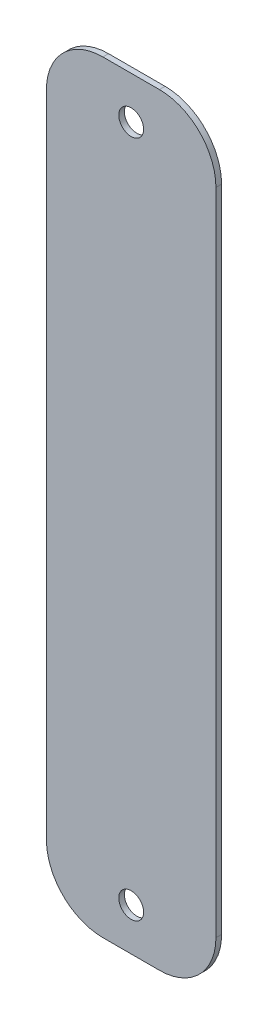
ISO-10303-21;
HEADER;
FILE_DESCRIPTION(('STEP AP214'),'2;1');
FILE_NAME('part.step','',(''),(''),'','','');
FILE_SCHEMA(('AUTOMOTIVE_DESIGN { 1 0 10303 214 1 1 1 1 }'));
ENDSEC;
DATA;
#1=APPLICATION_CONTEXT('core data for automotive mechanical design processes');
#2=APPLICATION_PROTOCOL_DEFINITION('international standard','automotive_design',2000,#1);
#3=PRODUCT_CONTEXT('',#1,'mechanical');
#4=PRODUCT('Part','Part','',(#3));
#5=PRODUCT_RELATED_PRODUCT_CATEGORY('part','',(#4));
#6=PRODUCT_DEFINITION_FORMATION('','',#4);
#7=PRODUCT_DEFINITION_CONTEXT('part definition',#1,'design');
#8=PRODUCT_DEFINITION('design','',#6,#7);
#9=PRODUCT_DEFINITION_SHAPE('','',#8);
#10=(LENGTH_UNIT() NAMED_UNIT(*) SI_UNIT(.MILLI.,.METRE.));
#11=(NAMED_UNIT(*) PLANE_ANGLE_UNIT() SI_UNIT($,.RADIAN.));
#12=(NAMED_UNIT(*) SI_UNIT($,.STERADIAN.) SOLID_ANGLE_UNIT());
#13=UNCERTAINTY_MEASURE_WITH_UNIT(LENGTH_MEASURE(1.E-05),#10,'distance_accuracy_value','');
#14=(GEOMETRIC_REPRESENTATION_CONTEXT(3) GLOBAL_UNCERTAINTY_ASSIGNED_CONTEXT((#13)) GLOBAL_UNIT_ASSIGNED_CONTEXT((#10,
#11,#12)) REPRESENTATION_CONTEXT('',''));
#15=CARTESIAN_POINT('',(0.,0.,0.));
#16=DIRECTION('',(0.,0.,1.));
#17=DIRECTION('',(1.,0.,0.));
#18=AXIS2_PLACEMENT_3D('',#15,#16,#17);
#19=CARTESIAN_POINT('',(0.,0.,2.));
#20=DIRECTION('',(0.,0.,-1.));
#21=DIRECTION('',(-1.,0.,0.));
#22=AXIS2_PLACEMENT_3D('',#19,#20,#21);
#23=PLANE('',#22);
#24=DIRECTION('',(1.,0.,0.));
#25=VECTOR('',#24,1.);
#26=CARTESIAN_POINT('',(-30.,-135.,2.));
#27=LINE('',#26,#25);
#28=CARTESIAN_POINT('',(-10.,-135.,2.));
#29=VERTEX_POINT('',#28);
#30=CARTESIAN_POINT('',(9.99999999999999,-135.,2.));
#31=VERTEX_POINT('',#30);
#32=EDGE_CURVE('E146',#29,#31,#27,.T.);
#33=ORIENTED_EDGE('',*,*,#32,.T.);
#34=CARTESIAN_POINT('',(10.,-115.,2.));
#35=DIRECTION('',(0.,0.,-1.));
#36=DIRECTION('',(-1.,0.,0.));
#37=AXIS2_PLACEMENT_3D('',#34,#35,#36);
#38=CIRCLE('',#37,20.);
#39=CARTESIAN_POINT('',(30.,-115.,2.));
#40=VERTEX_POINT('',#39);
#41=EDGE_CURVE('E165',#31,#40,#38,.F.);
#42=ORIENTED_EDGE('',*,*,#41,.T.);
#43=DIRECTION('',(0.,1.,0.));
#44=VECTOR('',#43,1.);
#45=CARTESIAN_POINT('',(30.,-135.,2.));
#46=LINE('',#45,#44);
#47=CARTESIAN_POINT('',(30.,115.,2.));
#48=VERTEX_POINT('',#47);
#49=EDGE_CURVE('E129',#40,#48,#46,.T.);
#50=ORIENTED_EDGE('',*,*,#49,.T.);
#51=CARTESIAN_POINT('',(9.99999999999999,115.,2.));
#52=DIRECTION('',(0.,0.,-1.));
#53=DIRECTION('',(-1.,0.,0.));
#54=AXIS2_PLACEMENT_3D('',#51,#52,#53);
#55=CIRCLE('',#54,20.);
#56=CARTESIAN_POINT('',(9.99999999999999,135.,2.));
#57=VERTEX_POINT('',#56);
#58=EDGE_CURVE('E160',#48,#57,#55,.F.);
#59=ORIENTED_EDGE('',*,*,#58,.T.);
#60=DIRECTION('',(-1.,0.,0.));
#61=VECTOR('',#60,1.);
#62=CARTESIAN_POINT('',(-30.,135.,2.));
#63=LINE('',#62,#61);
#64=CARTESIAN_POINT('',(-10.,135.,2.));
#65=VERTEX_POINT('',#64);
#66=EDGE_CURVE('E176',#57,#65,#63,.T.);
#67=ORIENTED_EDGE('',*,*,#66,.T.);
#68=CARTESIAN_POINT('',(-10.,115.,2.));
#69=DIRECTION('',(0.,0.,-1.));
#70=DIRECTION('',(-1.,0.,0.));
#71=AXIS2_PLACEMENT_3D('',#68,#69,#70);
#72=CIRCLE('',#71,20.);
#73=CARTESIAN_POINT('',(-30.,115.,2.));
#74=VERTEX_POINT('',#73);
#75=EDGE_CURVE('E65',#65,#74,#72,.F.);
#76=ORIENTED_EDGE('',*,*,#75,.T.);
#77=DIRECTION('',(0.,-1.,0.));
#78=VECTOR('',#77,1.);
#79=CARTESIAN_POINT('',(-30.,-135.,2.));
#80=LINE('',#79,#78);
#81=CARTESIAN_POINT('',(-30.,-115.,2.));
#82=VERTEX_POINT('',#81);
#83=EDGE_CURVE('E184',#74,#82,#80,.T.);
#84=ORIENTED_EDGE('',*,*,#83,.T.);
#85=CARTESIAN_POINT('',(-10.,-115.,2.));
#86=DIRECTION('',(0.,0.,-1.));
#87=DIRECTION('',(-1.,0.,0.));
#88=AXIS2_PLACEMENT_3D('',#85,#86,#87);
#89=CIRCLE('',#88,20.);
#90=EDGE_CURVE('E163',#82,#29,#89,.F.);
#91=ORIENTED_EDGE('',*,*,#90,.T.);
#92=EDGE_LOOP('',(#33,#42,#50,#59,#67,#76,#84,#91));
#93=FACE_BOUND('',#92,.T.);
#94=CARTESIAN_POINT('',(0.,120.,2.));
#95=DIRECTION('',(0.,0.,1.));
#96=DIRECTION('',(1.,0.,0.));
#97=AXIS2_PLACEMENT_3D('',#94,#95,#96);
#98=CIRCLE('',#97,4.4);
#99=CARTESIAN_POINT('',(4.4,120.,2.));
#100=VERTEX_POINT('',#99);
#101=EDGE_CURVE('E137',#100,#100,#98,.T.);
#102=ORIENTED_EDGE('',*,*,#101,.F.);
#103=EDGE_LOOP('',(#102));
#104=FACE_BOUND('',#103,.T.);
#105=CARTESIAN_POINT('',(0.,-120.,2.));
#106=DIRECTION('',(0.,0.,1.));
#107=DIRECTION('',(-1.,0.,0.));
#108=AXIS2_PLACEMENT_3D('',#105,#106,#107);
#109=CIRCLE('',#108,4.4);
#110=CARTESIAN_POINT('',(-4.4,-120.,2.));
#111=VERTEX_POINT('',#110);
#112=EDGE_CURVE('E191',#111,#111,#109,.T.);
#113=ORIENTED_EDGE('',*,*,#112,.F.);
#114=EDGE_LOOP('',(#113));
#115=FACE_BOUND('',#114,.T.);
#116=ADVANCED_FACE('F43',(#93,#104,#115),#23,.F.);
#117=CARTESIAN_POINT('',(0.,0.,0.));
#118=DIRECTION('',(0.,0.,-1.));
#119=DIRECTION('',(-1.,0.,0.));
#120=AXIS2_PLACEMENT_3D('',#117,#118,#119);
#121=PLANE('',#120);
#122=CARTESIAN_POINT('',(0.,120.,0.));
#123=DIRECTION('',(0.,0.,1.));
#124=DIRECTION('',(1.,0.,0.));
#125=AXIS2_PLACEMENT_3D('',#122,#123,#124);
#126=CIRCLE('',#125,4.4);
#127=CARTESIAN_POINT('',(4.4,120.,0.));
#128=VERTEX_POINT('',#127);
#129=EDGE_CURVE('E143',#128,#128,#126,.T.);
#130=ORIENTED_EDGE('',*,*,#129,.T.);
#131=EDGE_LOOP('',(#130));
#132=FACE_BOUND('',#131,.T.);
#133=DIRECTION('',(0.,1.,0.));
#134=VECTOR('',#133,1.);
#135=CARTESIAN_POINT('',(30.,-135.,0.));
#136=LINE('',#135,#134);
#137=CARTESIAN_POINT('',(30.,-115.,0.));
#138=VERTEX_POINT('',#137);
#139=CARTESIAN_POINT('',(30.,115.,0.));
#140=VERTEX_POINT('',#139);
#141=EDGE_CURVE('E126',#138,#140,#136,.T.);
#142=ORIENTED_EDGE('',*,*,#141,.F.);
#143=CARTESIAN_POINT('',(10.,-115.,0.));
#144=DIRECTION('',(0.,0.,-1.));
#145=DIRECTION('',(-1.,0.,0.));
#146=AXIS2_PLACEMENT_3D('',#143,#144,#145);
#147=CIRCLE('',#146,20.);
#148=CARTESIAN_POINT('',(9.99999999999999,-135.,0.));
#149=VERTEX_POINT('',#148);
#150=EDGE_CURVE('E109',#138,#149,#147,.T.);
#151=ORIENTED_EDGE('',*,*,#150,.T.);
#152=DIRECTION('',(1.,0.,0.));
#153=VECTOR('',#152,1.);
#154=CARTESIAN_POINT('',(-30.,-135.,0.));
#155=LINE('',#154,#153);
#156=CARTESIAN_POINT('',(-10.,-135.,0.));
#157=VERTEX_POINT('',#156);
#158=EDGE_CURVE('E150',#157,#149,#155,.T.);
#159=ORIENTED_EDGE('',*,*,#158,.F.);
#160=CARTESIAN_POINT('',(-10.,-115.,0.));
#161=DIRECTION('',(0.,0.,-1.));
#162=DIRECTION('',(-1.,0.,0.));
#163=AXIS2_PLACEMENT_3D('',#160,#161,#162);
#164=CIRCLE('',#163,20.);
#165=CARTESIAN_POINT('',(-30.,-115.,0.));
#166=VERTEX_POINT('',#165);
#167=EDGE_CURVE('E120',#157,#166,#164,.T.);
#168=ORIENTED_EDGE('',*,*,#167,.T.);
#169=DIRECTION('',(0.,-1.,0.));
#170=VECTOR('',#169,1.);
#171=CARTESIAN_POINT('',(-30.,-135.,0.));
#172=LINE('',#171,#170);
#173=CARTESIAN_POINT('',(-30.,115.,0.));
#174=VERTEX_POINT('',#173);
#175=EDGE_CURVE('E140',#174,#166,#172,.T.);
#176=ORIENTED_EDGE('',*,*,#175,.F.);
#177=CARTESIAN_POINT('',(-10.,115.,0.));
#178=DIRECTION('',(0.,0.,-1.));
#179=DIRECTION('',(-1.,0.,0.));
#180=AXIS2_PLACEMENT_3D('',#177,#178,#179);
#181=CIRCLE('',#180,20.);
#182=CARTESIAN_POINT('',(-10.,135.,0.));
#183=VERTEX_POINT('',#182);
#184=EDGE_CURVE('E154',#174,#183,#181,.T.);
#185=ORIENTED_EDGE('',*,*,#184,.T.);
#186=DIRECTION('',(-1.,0.,0.));
#187=VECTOR('',#186,1.);
#188=CARTESIAN_POINT('',(-30.,135.,0.));
#189=LINE('',#188,#187);
#190=CARTESIAN_POINT('',(9.99999999999999,135.,0.));
#191=VERTEX_POINT('',#190);
#192=EDGE_CURVE('E136',#191,#183,#189,.T.);
#193=ORIENTED_EDGE('',*,*,#192,.F.);
#194=CARTESIAN_POINT('',(9.99999999999999,115.,0.));
#195=DIRECTION('',(0.,0.,-1.));
#196=DIRECTION('',(-1.,0.,0.));
#197=AXIS2_PLACEMENT_3D('',#194,#195,#196);
#198=CIRCLE('',#197,20.);
#199=EDGE_CURVE('E130',#191,#140,#198,.T.);
#200=ORIENTED_EDGE('',*,*,#199,.T.);
#201=EDGE_LOOP('',(#142,#151,#159,#168,#176,#185,#193,#200));
#202=FACE_BOUND('',#201,.T.);
#203=CARTESIAN_POINT('',(0.,-120.,0.));
#204=DIRECTION('',(0.,0.,1.));
#205=DIRECTION('',(-1.,0.,0.));
#206=AXIS2_PLACEMENT_3D('',#203,#204,#205);
#207=CIRCLE('',#206,4.4);
#208=CARTESIAN_POINT('',(-4.4,-120.,0.));
#209=VERTEX_POINT('',#208);
#210=EDGE_CURVE('E193',#209,#209,#207,.T.);
#211=ORIENTED_EDGE('',*,*,#210,.T.);
#212=EDGE_LOOP('',(#211));
#213=FACE_BOUND('',#212,.T.);
#214=ADVANCED_FACE('F133',(#132,#202,#213),#121,.T.);
#215=CARTESIAN_POINT('',(30.,-135.,2.));
#216=DIRECTION('',(-1.,0.,0.));
#217=DIRECTION('',(0.,0.,1.));
#218=AXIS2_PLACEMENT_3D('',#215,#216,#217);
#219=PLANE('',#218);
#220=ORIENTED_EDGE('',*,*,#49,.F.);
#221=DIRECTION('',(0.,0.,-1.));
#222=VECTOR('',#221,1.);
#223=CARTESIAN_POINT('',(30.,-115.,2.));
#224=LINE('',#223,#222);
#225=EDGE_CURVE('E113',#40,#138,#224,.T.);
#226=ORIENTED_EDGE('',*,*,#225,.T.);
#227=ORIENTED_EDGE('',*,*,#141,.T.);
#228=DIRECTION('',(0.,0.,-1.));
#229=VECTOR('',#228,1.);
#230=CARTESIAN_POINT('',(30.,115.,2.));
#231=LINE('',#230,#229);
#232=EDGE_CURVE('E131',#140,#48,#231,.F.);
#233=ORIENTED_EDGE('',*,*,#232,.T.);
#234=EDGE_LOOP('',(#220,#226,#227,#233));
#235=FACE_BOUND('',#234,.T.);
#236=ADVANCED_FACE('F125',(#235),#219,.F.);
#237=CARTESIAN_POINT('',(-30.,135.,2.));
#238=DIRECTION('',(0.,-1.,0.));
#239=DIRECTION('',(0.,0.,-1.));
#240=AXIS2_PLACEMENT_3D('',#237,#238,#239);
#241=PLANE('',#240);
#242=ORIENTED_EDGE('',*,*,#192,.T.);
#243=DIRECTION('',(0.,0.,-1.));
#244=VECTOR('',#243,1.);
#245=CARTESIAN_POINT('',(-10.,135.,2.));
#246=LINE('',#245,#244);
#247=EDGE_CURVE('E11',#183,#65,#246,.F.);
#248=ORIENTED_EDGE('',*,*,#247,.T.);
#249=ORIENTED_EDGE('',*,*,#66,.F.);
#250=DIRECTION('',(0.,0.,-1.));
#251=VECTOR('',#250,1.);
#252=CARTESIAN_POINT('',(9.99999999999999,135.,2.));
#253=LINE('',#252,#251);
#254=EDGE_CURVE('E51',#57,#191,#253,.T.);
#255=ORIENTED_EDGE('',*,*,#254,.T.);
#256=EDGE_LOOP('',(#242,#248,#249,#255));
#257=FACE_BOUND('',#256,.T.);
#258=ADVANCED_FACE('F174',(#257),#241,.F.);
#259=CARTESIAN_POINT('',(-30.,-135.,2.));
#260=DIRECTION('',(1.,0.,0.));
#261=DIRECTION('',(0.,0.,-1.));
#262=AXIS2_PLACEMENT_3D('',#259,#260,#261);
#263=PLANE('',#262);
#264=ORIENTED_EDGE('',*,*,#175,.T.);
#265=DIRECTION('',(0.,0.,-1.));
#266=VECTOR('',#265,1.);
#267=CARTESIAN_POINT('',(-30.,-115.,2.));
#268=LINE('',#267,#266);
#269=EDGE_CURVE('E58',#166,#82,#268,.F.);
#270=ORIENTED_EDGE('',*,*,#269,.T.);
#271=ORIENTED_EDGE('',*,*,#83,.F.);
#272=DIRECTION('',(0.,0.,-1.));
#273=VECTOR('',#272,1.);
#274=CARTESIAN_POINT('',(-30.,115.,2.));
#275=LINE('',#274,#273);
#276=EDGE_CURVE('E167',#74,#174,#275,.T.);
#277=ORIENTED_EDGE('',*,*,#276,.T.);
#278=EDGE_LOOP('',(#264,#270,#271,#277));
#279=FACE_BOUND('',#278,.T.);
#280=ADVANCED_FACE('F183',(#279),#263,.F.);
#281=CARTESIAN_POINT('',(-30.,-135.,2.));
#282=DIRECTION('',(0.,1.,0.));
#283=DIRECTION('',(0.,0.,1.));
#284=AXIS2_PLACEMENT_3D('',#281,#282,#283);
#285=PLANE('',#284);
#286=ORIENTED_EDGE('',*,*,#158,.T.);
#287=DIRECTION('',(0.,0.,-1.));
#288=VECTOR('',#287,1.);
#289=CARTESIAN_POINT('',(9.99999999999999,-135.,2.));
#290=LINE('',#289,#288);
#291=EDGE_CURVE('E114',#149,#31,#290,.F.);
#292=ORIENTED_EDGE('',*,*,#291,.T.);
#293=ORIENTED_EDGE('',*,*,#32,.F.);
#294=DIRECTION('',(0.,0.,-1.));
#295=VECTOR('',#294,1.);
#296=CARTESIAN_POINT('',(-10.,-135.,2.));
#297=LINE('',#296,#295);
#298=EDGE_CURVE('E119',#29,#157,#297,.T.);
#299=ORIENTED_EDGE('',*,*,#298,.T.);
#300=EDGE_LOOP('',(#286,#292,#293,#299));
#301=FACE_BOUND('',#300,.T.);
#302=ADVANCED_FACE('F215',(#301),#285,.F.);
#303=CARTESIAN_POINT('',(0.,120.,2.));
#304=DIRECTION('',(0.,0.,-1.));
#305=DIRECTION('',(-1.,0.,0.));
#306=AXIS2_PLACEMENT_3D('',#303,#304,#305);
#307=CYLINDRICAL_SURFACE('',#306,4.4);
#308=ORIENTED_EDGE('',*,*,#101,.T.);
#309=EDGE_LOOP('',(#308));
#310=FACE_BOUND('',#309,.T.);
#311=ORIENTED_EDGE('',*,*,#129,.F.);
#312=EDGE_LOOP('',(#311));
#313=FACE_BOUND('',#312,.T.);
#314=ADVANCED_FACE('F212',(#310,#313),#307,.F.);
#315=CARTESIAN_POINT('',(0.,-120.,2.));
#316=DIRECTION('',(0.,0.,-1.));
#317=DIRECTION('',(-1.,0.,0.));
#318=AXIS2_PLACEMENT_3D('',#315,#316,#317);
#319=CYLINDRICAL_SURFACE('',#318,4.4);
#320=ORIENTED_EDGE('',*,*,#112,.T.);
#321=EDGE_LOOP('',(#320));
#322=FACE_BOUND('',#321,.T.);
#323=ORIENTED_EDGE('',*,*,#210,.F.);
#324=EDGE_LOOP('',(#323));
#325=FACE_BOUND('',#324,.T.);
#326=ADVANCED_FACE('F199',(#322,#325),#319,.F.);
#327=CARTESIAN_POINT('',(10.,-115.,2.));
#328=DIRECTION('',(0.,0.,-1.));
#329=DIRECTION('',(-1.,0.,0.));
#330=AXIS2_PLACEMENT_3D('',#327,#328,#329);
#331=CYLINDRICAL_SURFACE('',#330,20.);
#332=ORIENTED_EDGE('',*,*,#41,.F.);
#333=ORIENTED_EDGE('',*,*,#291,.F.);
#334=ORIENTED_EDGE('',*,*,#150,.F.);
#335=ORIENTED_EDGE('',*,*,#225,.F.);
#336=EDGE_LOOP('',(#332,#333,#334,#335));
#337=FACE_BOUND('',#336,.T.);
#338=ADVANCED_FACE('F112',(#337),#331,.T.);
#339=CARTESIAN_POINT('',(-10.,-115.,2.));
#340=DIRECTION('',(0.,0.,-1.));
#341=DIRECTION('',(-1.,0.,0.));
#342=AXIS2_PLACEMENT_3D('',#339,#340,#341);
#343=CYLINDRICAL_SURFACE('',#342,20.);
#344=ORIENTED_EDGE('',*,*,#90,.F.);
#345=ORIENTED_EDGE('',*,*,#269,.F.);
#346=ORIENTED_EDGE('',*,*,#167,.F.);
#347=ORIENTED_EDGE('',*,*,#298,.F.);
#348=EDGE_LOOP('',(#344,#345,#346,#347));
#349=FACE_BOUND('',#348,.T.);
#350=ADVANCED_FACE('F227',(#349),#343,.T.);
#351=CARTESIAN_POINT('',(-10.,115.,2.));
#352=DIRECTION('',(0.,0.,-1.));
#353=DIRECTION('',(-1.,0.,0.));
#354=AXIS2_PLACEMENT_3D('',#351,#352,#353);
#355=CYLINDRICAL_SURFACE('',#354,20.);
#356=ORIENTED_EDGE('',*,*,#75,.F.);
#357=ORIENTED_EDGE('',*,*,#247,.F.);
#358=ORIENTED_EDGE('',*,*,#184,.F.);
#359=ORIENTED_EDGE('',*,*,#276,.F.);
#360=EDGE_LOOP('',(#356,#357,#358,#359));
#361=FACE_BOUND('',#360,.T.);
#362=ADVANCED_FACE('F182',(#361),#355,.T.);
#363=CARTESIAN_POINT('',(9.99999999999999,115.,2.));
#364=DIRECTION('',(0.,0.,-1.));
#365=DIRECTION('',(-1.,0.,0.));
#366=AXIS2_PLACEMENT_3D('',#363,#364,#365);
#367=CYLINDRICAL_SURFACE('',#366,20.);
#368=ORIENTED_EDGE('',*,*,#58,.F.);
#369=ORIENTED_EDGE('',*,*,#232,.F.);
#370=ORIENTED_EDGE('',*,*,#199,.F.);
#371=ORIENTED_EDGE('',*,*,#254,.F.);
#372=EDGE_LOOP('',(#368,#369,#370,#371));
#373=FACE_BOUND('',#372,.T.);
#374=ADVANCED_FACE('F45',(#373),#367,.T.);
#375=CLOSED_SHELL('',(#116,#214,#236,#258,#280,#302,#314,#326,#338,#350,#362,#374));
#376=MANIFOLD_SOLID_BREP('B2',#375);
#377=ADVANCED_BREP_SHAPE_REPRESENTATION('',(#18,#376),#14);
#378=SHAPE_DEFINITION_REPRESENTATION(#9,#377);
ENDSEC;
END-ISO-10303-21;
